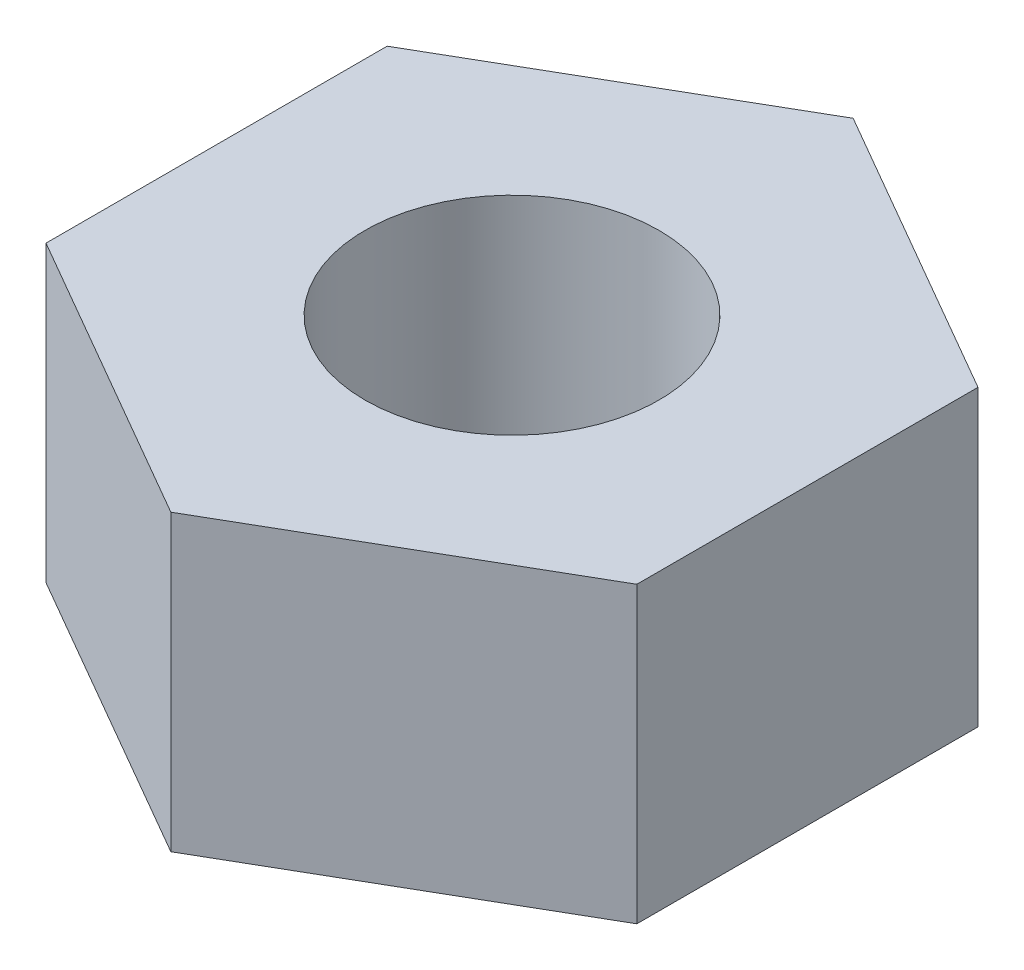
ISO-10303-21;
HEADER;
FILE_DESCRIPTION(('STEP AP214'),'2;1');
FILE_NAME('part.step','',(''),(''),'','','');
FILE_SCHEMA(('AUTOMOTIVE_DESIGN { 1 0 10303 214 1 1 1 1 }'));
ENDSEC;
DATA;
#1=APPLICATION_CONTEXT('core data for automotive mechanical design processes');
#2=APPLICATION_PROTOCOL_DEFINITION('international standard','automotive_design',2000,#1);
#3=PRODUCT_CONTEXT('',#1,'mechanical');
#4=PRODUCT('Part','Part','',(#3));
#5=PRODUCT_RELATED_PRODUCT_CATEGORY('part','',(#4));
#6=PRODUCT_DEFINITION_FORMATION('','',#4);
#7=PRODUCT_DEFINITION_CONTEXT('part definition',#1,'design');
#8=PRODUCT_DEFINITION('design','',#6,#7);
#9=PRODUCT_DEFINITION_SHAPE('','',#8);
#10=(LENGTH_UNIT() NAMED_UNIT(*) SI_UNIT(.MILLI.,.METRE.));
#11=(NAMED_UNIT(*) PLANE_ANGLE_UNIT() SI_UNIT($,.RADIAN.));
#12=(NAMED_UNIT(*) SI_UNIT($,.STERADIAN.) SOLID_ANGLE_UNIT());
#13=UNCERTAINTY_MEASURE_WITH_UNIT(LENGTH_MEASURE(1.E-05),#10,'distance_accuracy_value','');
#14=(GEOMETRIC_REPRESENTATION_CONTEXT(3) GLOBAL_UNCERTAINTY_ASSIGNED_CONTEXT((#13)) GLOBAL_UNIT_ASSIGNED_CONTEXT((#10,
#11,#12)) REPRESENTATION_CONTEXT('',''));
#15=CARTESIAN_POINT('',(0.,0.,0.));
#16=DIRECTION('',(0.,0.,1.));
#17=DIRECTION('',(1.,0.,0.));
#18=AXIS2_PLACEMENT_3D('',#15,#16,#17);
#19=CARTESIAN_POINT('',(0.,6.35,0.));
#20=DIRECTION('',(0.,1.,0.));
#21=DIRECTION('',(0.,0.,1.));
#22=AXIS2_PLACEMENT_3D('',#19,#20,#21);
#23=PLANE('',#22);
#24=DIRECTION('',(0.866025403784438,0.,0.500000000000001));
#25=VECTOR('',#24,1.);
#26=CARTESIAN_POINT('',(-6.37914312427618,6.35,3.683));
#27=LINE('',#26,#25);
#28=CARTESIAN_POINT('',(-6.37914312427618,6.35,3.683));
#29=VERTEX_POINT('',#28);
#30=CARTESIAN_POINT('',(0.,6.35,7.366));
#31=VERTEX_POINT('',#30);
#32=EDGE_CURVE('E146',#29,#31,#27,.T.);
#33=ORIENTED_EDGE('',*,*,#32,.T.);
#34=DIRECTION('',(0.866025403784439,0.,-0.499999999999999));
#35=VECTOR('',#34,1.);
#36=CARTESIAN_POINT('',(0.,6.35,7.366));
#37=LINE('',#36,#35);
#38=CARTESIAN_POINT('',(6.37914312427618,6.35,3.68300000000001));
#39=VERTEX_POINT('',#38);
#40=EDGE_CURVE('E94',#31,#39,#37,.T.);
#41=ORIENTED_EDGE('',*,*,#40,.T.);
#42=DIRECTION('',(0.,0.,-1.));
#43=VECTOR('',#42,1.);
#44=CARTESIAN_POINT('',(6.37914312427618,6.35,3.68300000000001));
#45=LINE('',#44,#43);
#46=CARTESIAN_POINT('',(6.37914312427618,6.35,-3.683));
#47=VERTEX_POINT('',#46);
#48=EDGE_CURVE('E107',#39,#47,#45,.T.);
#49=ORIENTED_EDGE('',*,*,#48,.T.);
#50=DIRECTION('',(-0.866025403784438,0.,-0.5));
#51=VECTOR('',#50,1.);
#52=CARTESIAN_POINT('',(6.37914312427618,6.35,-3.683));
#53=LINE('',#52,#51);
#54=CARTESIAN_POINT('',(0.,6.35,-7.366));
#55=VERTEX_POINT('',#54);
#56=EDGE_CURVE('E101',#47,#55,#53,.T.);
#57=ORIENTED_EDGE('',*,*,#56,.T.);
#58=DIRECTION('',(-0.866025403784439,0.,0.499999999999999));
#59=VECTOR('',#58,1.);
#60=CARTESIAN_POINT('',(0.,6.35,-7.366));
#61=LINE('',#60,#59);
#62=CARTESIAN_POINT('',(-6.37914312427618,6.35,-3.68300000000001));
#63=VERTEX_POINT('',#62);
#64=EDGE_CURVE('E105',#55,#63,#61,.T.);
#65=ORIENTED_EDGE('',*,*,#64,.T.);
#66=DIRECTION('',(0.,0.,1.));
#67=VECTOR('',#66,1.);
#68=CARTESIAN_POINT('',(-6.37914312427618,6.35,-3.68300000000001));
#69=LINE('',#68,#67);
#70=EDGE_CURVE('E57',#63,#29,#69,.T.);
#71=ORIENTED_EDGE('',*,*,#70,.T.);
#72=EDGE_LOOP('',(#33,#41,#49,#57,#65,#71));
#73=FACE_BOUND('',#72,.T.);
#74=CARTESIAN_POINT('',(0.,6.35,0.));
#75=DIRECTION('',(0.,1.,0.));
#76=DIRECTION('',(0.,0.,1.));
#77=AXIS2_PLACEMENT_3D('',#74,#75,#76);
#78=CIRCLE('',#77,3.175);
#79=CARTESIAN_POINT('',(0.,6.35,3.175));
#80=VERTEX_POINT('',#79);
#81=EDGE_CURVE('E134',#80,#80,#78,.T.);
#82=ORIENTED_EDGE('',*,*,#81,.F.);
#83=EDGE_LOOP('',(#82));
#84=FACE_BOUND('',#83,.T.);
#85=ADVANCED_FACE('F39',(#73,#84),#23,.T.);
#86=CARTESIAN_POINT('',(0.,0.,0.));
#87=DIRECTION('',(0.,1.,0.));
#88=DIRECTION('',(0.,0.,1.));
#89=AXIS2_PLACEMENT_3D('',#86,#87,#88);
#90=PLANE('',#89);
#91=DIRECTION('',(0.866025403784438,0.,0.500000000000001));
#92=VECTOR('',#91,1.);
#93=CARTESIAN_POINT('',(-6.37914312427618,0.,3.683));
#94=LINE('',#93,#92);
#95=CARTESIAN_POINT('',(-6.37914312427618,0.,3.683));
#96=VERTEX_POINT('',#95);
#97=CARTESIAN_POINT('',(0.,0.,7.366));
#98=VERTEX_POINT('',#97);
#99=EDGE_CURVE('E129',#96,#98,#94,.T.);
#100=ORIENTED_EDGE('',*,*,#99,.F.);
#101=DIRECTION('',(0.,0.,1.));
#102=VECTOR('',#101,1.);
#103=CARTESIAN_POINT('',(-6.37914312427618,0.,-3.68300000000001));
#104=LINE('',#103,#102);
#105=CARTESIAN_POINT('',(-6.37914312427618,0.,-3.68300000000001));
#106=VERTEX_POINT('',#105);
#107=EDGE_CURVE('E86',#106,#96,#104,.T.);
#108=ORIENTED_EDGE('',*,*,#107,.F.);
#109=DIRECTION('',(-0.866025403784439,0.,0.499999999999999));
#110=VECTOR('',#109,1.);
#111=CARTESIAN_POINT('',(0.,0.,-7.366));
#112=LINE('',#111,#110);
#113=CARTESIAN_POINT('',(0.,0.,-7.366));
#114=VERTEX_POINT('',#113);
#115=EDGE_CURVE('E80',#114,#106,#112,.T.);
#116=ORIENTED_EDGE('',*,*,#115,.F.);
#117=DIRECTION('',(-0.866025403784438,0.,-0.5));
#118=VECTOR('',#117,1.);
#119=CARTESIAN_POINT('',(6.37914312427618,0.,-3.683));
#120=LINE('',#119,#118);
#121=CARTESIAN_POINT('',(6.37914312427618,0.,-3.683));
#122=VERTEX_POINT('',#121);
#123=EDGE_CURVE('E116',#122,#114,#120,.T.);
#124=ORIENTED_EDGE('',*,*,#123,.F.);
#125=DIRECTION('',(0.,0.,-1.));
#126=VECTOR('',#125,1.);
#127=CARTESIAN_POINT('',(6.37914312427618,0.,3.68300000000001));
#128=LINE('',#127,#126);
#129=CARTESIAN_POINT('',(6.37914312427618,0.,3.68300000000001));
#130=VERTEX_POINT('',#129);
#131=EDGE_CURVE('E137',#130,#122,#128,.T.);
#132=ORIENTED_EDGE('',*,*,#131,.F.);
#133=DIRECTION('',(0.866025403784439,0.,-0.499999999999999));
#134=VECTOR('',#133,1.);
#135=CARTESIAN_POINT('',(0.,0.,7.366));
#136=LINE('',#135,#134);
#137=EDGE_CURVE('E133',#98,#130,#136,.T.);
#138=ORIENTED_EDGE('',*,*,#137,.F.);
#139=EDGE_LOOP('',(#100,#108,#116,#124,#132,#138));
#140=FACE_BOUND('',#139,.T.);
#141=CARTESIAN_POINT('',(0.,0.,0.));
#142=DIRECTION('',(0.,1.,0.));
#143=DIRECTION('',(0.,0.,1.));
#144=AXIS2_PLACEMENT_3D('',#141,#142,#143);
#145=CIRCLE('',#144,3.175);
#146=CARTESIAN_POINT('',(0.,0.,3.175));
#147=VERTEX_POINT('',#146);
#148=EDGE_CURVE('E243',#147,#147,#145,.T.);
#149=ORIENTED_EDGE('',*,*,#148,.T.);
#150=EDGE_LOOP('',(#149));
#151=FACE_BOUND('',#150,.T.);
#152=ADVANCED_FACE('F159',(#140,#151),#90,.F.);
#153=CARTESIAN_POINT('',(-6.37914312427618,6.35,3.683));
#154=DIRECTION('',(0.500000000000001,0.,-0.866025403784438));
#155=DIRECTION('',(-0.866025403784438,0.,-0.500000000000001));
#156=AXIS2_PLACEMENT_3D('',#153,#154,#155);
#157=PLANE('',#156);
#158=ORIENTED_EDGE('',*,*,#99,.T.);
#159=DIRECTION('',(0.,-1.,0.));
#160=VECTOR('',#159,1.);
#161=CARTESIAN_POINT('',(0.,6.35,7.366));
#162=LINE('',#161,#160);
#163=EDGE_CURVE('E11',#31,#98,#162,.T.);
#164=ORIENTED_EDGE('',*,*,#163,.F.);
#165=ORIENTED_EDGE('',*,*,#32,.F.);
#166=DIRECTION('',(0.,-1.,0.));
#167=VECTOR('',#166,1.);
#168=CARTESIAN_POINT('',(-6.37914312427618,6.35,3.683));
#169=LINE('',#168,#167);
#170=EDGE_CURVE('E125',#29,#96,#169,.T.);
#171=ORIENTED_EDGE('',*,*,#170,.T.);
#172=EDGE_LOOP('',(#158,#164,#165,#171));
#173=FACE_BOUND('',#172,.T.);
#174=ADVANCED_FACE('F41',(#173),#157,.F.);
#175=CARTESIAN_POINT('',(0.,6.35,7.366));
#176=DIRECTION('',(-0.499999999999999,0.,-0.866025403784439));
#177=DIRECTION('',(-0.866025403784439,0.,0.499999999999999));
#178=AXIS2_PLACEMENT_3D('',#175,#176,#177);
#179=PLANE('',#178);
#180=ORIENTED_EDGE('',*,*,#137,.T.);
#181=DIRECTION('',(0.,-1.,0.));
#182=VECTOR('',#181,1.);
#183=CARTESIAN_POINT('',(6.37914312427618,6.35,3.68300000000001));
#184=LINE('',#183,#182);
#185=EDGE_CURVE('E49',#39,#130,#184,.T.);
#186=ORIENTED_EDGE('',*,*,#185,.F.);
#187=ORIENTED_EDGE('',*,*,#40,.F.);
#188=ORIENTED_EDGE('',*,*,#163,.T.);
#189=EDGE_LOOP('',(#180,#186,#187,#188));
#190=FACE_BOUND('',#189,.T.);
#191=ADVANCED_FACE('F184',(#190),#179,.F.);
#192=CARTESIAN_POINT('',(6.37914312427618,6.35,3.68300000000001));
#193=DIRECTION('',(-1.,0.,0.));
#194=DIRECTION('',(0.,0.,1.));
#195=AXIS2_PLACEMENT_3D('',#192,#193,#194);
#196=PLANE('',#195);
#197=ORIENTED_EDGE('',*,*,#131,.T.);
#198=DIRECTION('',(0.,-1.,0.));
#199=VECTOR('',#198,1.);
#200=CARTESIAN_POINT('',(6.37914312427618,6.35,-3.683));
#201=LINE('',#200,#199);
#202=EDGE_CURVE('E118',#47,#122,#201,.T.);
#203=ORIENTED_EDGE('',*,*,#202,.F.);
#204=ORIENTED_EDGE('',*,*,#48,.F.);
#205=ORIENTED_EDGE('',*,*,#185,.T.);
#206=EDGE_LOOP('',(#197,#203,#204,#205));
#207=FACE_BOUND('',#206,.T.);
#208=ADVANCED_FACE('F156',(#207),#196,.F.);
#209=CARTESIAN_POINT('',(6.37914312427618,6.35,-3.683));
#210=DIRECTION('',(-0.5,0.,0.866025403784438));
#211=DIRECTION('',(0.866025403784438,0.,0.5));
#212=AXIS2_PLACEMENT_3D('',#209,#210,#211);
#213=PLANE('',#212);
#214=ORIENTED_EDGE('',*,*,#123,.T.);
#215=DIRECTION('',(0.,-1.,0.));
#216=VECTOR('',#215,1.);
#217=CARTESIAN_POINT('',(0.,6.35,-7.366));
#218=LINE('',#217,#216);
#219=EDGE_CURVE('E113',#55,#114,#218,.T.);
#220=ORIENTED_EDGE('',*,*,#219,.F.);
#221=ORIENTED_EDGE('',*,*,#56,.F.);
#222=ORIENTED_EDGE('',*,*,#202,.T.);
#223=EDGE_LOOP('',(#214,#220,#221,#222));
#224=FACE_BOUND('',#223,.T.);
#225=ADVANCED_FACE('F114',(#224),#213,.F.);
#226=CARTESIAN_POINT('',(0.,6.35,-7.366));
#227=DIRECTION('',(0.499999999999999,0.,0.866025403784439));
#228=DIRECTION('',(0.866025403784439,0.,-0.5));
#229=AXIS2_PLACEMENT_3D('',#226,#227,#228);
#230=PLANE('',#229);
#231=ORIENTED_EDGE('',*,*,#115,.T.);
#232=DIRECTION('',(0.,-1.,0.));
#233=VECTOR('',#232,1.);
#234=CARTESIAN_POINT('',(-6.37914312427618,6.35,-3.68300000000001));
#235=LINE('',#234,#233);
#236=EDGE_CURVE('E119',#63,#106,#235,.T.);
#237=ORIENTED_EDGE('',*,*,#236,.F.);
#238=ORIENTED_EDGE('',*,*,#64,.F.);
#239=ORIENTED_EDGE('',*,*,#219,.T.);
#240=EDGE_LOOP('',(#231,#237,#238,#239));
#241=FACE_BOUND('',#240,.T.);
#242=ADVANCED_FACE('F121',(#241),#230,.F.);
#243=CARTESIAN_POINT('',(-6.37914312427618,6.35,-3.68300000000001));
#244=DIRECTION('',(1.,0.,0.));
#245=DIRECTION('',(0.,0.,-1.));
#246=AXIS2_PLACEMENT_3D('',#243,#244,#245);
#247=PLANE('',#246);
#248=ORIENTED_EDGE('',*,*,#107,.T.);
#249=ORIENTED_EDGE('',*,*,#170,.F.);
#250=ORIENTED_EDGE('',*,*,#70,.F.);
#251=ORIENTED_EDGE('',*,*,#236,.T.);
#252=EDGE_LOOP('',(#248,#249,#250,#251));
#253=FACE_BOUND('',#252,.T.);
#254=ADVANCED_FACE('F164',(#253),#247,.F.);
#255=CARTESIAN_POINT('',(0.,6.35,0.));
#256=DIRECTION('',(0.,-1.,0.));
#257=DIRECTION('',(0.,0.,-1.));
#258=AXIS2_PLACEMENT_3D('',#255,#256,#257);
#259=CYLINDRICAL_SURFACE('',#258,3.175);
#260=ORIENTED_EDGE('',*,*,#81,.T.);
#261=EDGE_LOOP('',(#260));
#262=FACE_BOUND('',#261,.T.);
#263=ORIENTED_EDGE('',*,*,#148,.F.);
#264=EDGE_LOOP('',(#263));
#265=FACE_BOUND('',#264,.T.);
#266=ADVANCED_FACE('F166',(#262,#265),#259,.F.);
#267=CLOSED_SHELL('',(#85,#152,#174,#191,#208,#225,#242,#254,#266));
#268=MANIFOLD_SOLID_BREP('B2',#267);
#269=ADVANCED_BREP_SHAPE_REPRESENTATION('',(#18,#268),#14);
#270=SHAPE_DEFINITION_REPRESENTATION(#9,#269);
ENDSEC;
END-ISO-10303-21;
